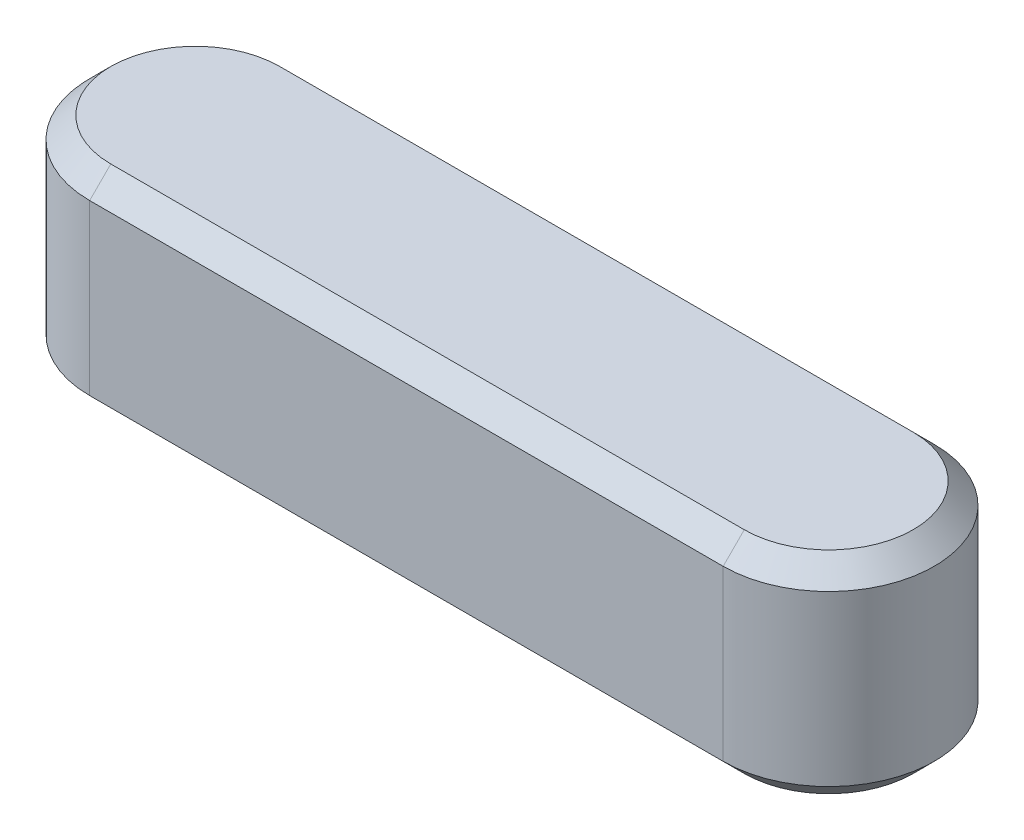
ISO-10303-21;
HEADER;
FILE_DESCRIPTION(('STEP AP214'),'2;1');
FILE_NAME('part.step','',(''),(''),'','','');
FILE_SCHEMA(('AUTOMOTIVE_DESIGN { 1 0 10303 214 1 1 1 1 }'));
ENDSEC;
DATA;
#1=APPLICATION_CONTEXT('core data for automotive mechanical design processes');
#2=APPLICATION_PROTOCOL_DEFINITION('international standard','automotive_design',2000,#1);
#3=PRODUCT_CONTEXT('',#1,'mechanical');
#4=PRODUCT('Part','Part','',(#3));
#5=PRODUCT_RELATED_PRODUCT_CATEGORY('part','',(#4));
#6=PRODUCT_DEFINITION_FORMATION('','',#4);
#7=PRODUCT_DEFINITION_CONTEXT('part definition',#1,'design');
#8=PRODUCT_DEFINITION('design','',#6,#7);
#9=PRODUCT_DEFINITION_SHAPE('','',#8);
#10=(LENGTH_UNIT() NAMED_UNIT(*) SI_UNIT(.MILLI.,.METRE.));
#11=(NAMED_UNIT(*) PLANE_ANGLE_UNIT() SI_UNIT($,.RADIAN.));
#12=(NAMED_UNIT(*) SI_UNIT($,.STERADIAN.) SOLID_ANGLE_UNIT());
#13=UNCERTAINTY_MEASURE_WITH_UNIT(LENGTH_MEASURE(1.E-05),#10,'distance_accuracy_value','');
#14=(GEOMETRIC_REPRESENTATION_CONTEXT(3) GLOBAL_UNCERTAINTY_ASSIGNED_CONTEXT((#13)) GLOBAL_UNIT_ASSIGNED_CONTEXT((#10,
#11,#12)) REPRESENTATION_CONTEXT('',''));
#15=CARTESIAN_POINT('',(0.,0.,0.));
#16=DIRECTION('',(0.,0.,1.));
#17=DIRECTION('',(1.,0.,0.));
#18=AXIS2_PLACEMENT_3D('',#15,#16,#17);
#19=CARTESIAN_POINT('',(0.,2.,0.));
#20=DIRECTION('',(0.,-1.,0.));
#21=DIRECTION('',(0.,0.,-1.));
#22=AXIS2_PLACEMENT_3D('',#19,#20,#21);
#23=CYLINDRICAL_SURFACE('',#22,1.);
#24=DIRECTION('',(0.,-1.,0.));
#25=VECTOR('',#24,1.);
#26=CARTESIAN_POINT('',(0.,2.,-1.));
#27=LINE('',#26,#25);
#28=CARTESIAN_POINT('',(0.,1.8,-1.));
#29=VERTEX_POINT('',#28);
#30=CARTESIAN_POINT('',(0.,0.2,-1.));
#31=VERTEX_POINT('',#30);
#32=EDGE_CURVE('E147',#29,#31,#27,.T.);
#33=ORIENTED_EDGE('',*,*,#32,.T.);
#34=CARTESIAN_POINT('',(0.,0.2,0.));
#35=DIRECTION('',(0.,1.,0.));
#36=DIRECTION('',(0.,0.,1.));
#37=AXIS2_PLACEMENT_3D('',#34,#35,#36);
#38=CIRCLE('',#37,1.);
#39=CARTESIAN_POINT('',(0.,0.2,1.));
#40=VERTEX_POINT('',#39);
#41=EDGE_CURVE('E156',#31,#40,#38,.T.);
#42=ORIENTED_EDGE('',*,*,#41,.T.);
#43=DIRECTION('',(0.,-1.,0.));
#44=VECTOR('',#43,1.);
#45=CARTESIAN_POINT('',(0.,2.,1.));
#46=LINE('',#45,#44);
#47=CARTESIAN_POINT('',(0.,1.8,1.));
#48=VERTEX_POINT('',#47);
#49=EDGE_CURVE('E125',#48,#40,#46,.T.);
#50=ORIENTED_EDGE('',*,*,#49,.F.);
#51=CARTESIAN_POINT('',(0.,1.8,0.));
#52=DIRECTION('',(0.,1.,0.));
#53=DIRECTION('',(0.,0.,1.));
#54=AXIS2_PLACEMENT_3D('',#51,#52,#53);
#55=CIRCLE('',#54,1.);
#56=EDGE_CURVE('E158',#48,#29,#55,.F.);
#57=ORIENTED_EDGE('',*,*,#56,.T.);
#58=EDGE_LOOP('',(#33,#42,#50,#57));
#59=FACE_BOUND('',#58,.T.);
#60=ADVANCED_FACE('F38',(#59),#23,.T.);
#61=CARTESIAN_POINT('',(0.,2.,1.));
#62=DIRECTION('',(0.,0.,-1.));
#63=DIRECTION('',(-1.,0.,0.));
#64=AXIS2_PLACEMENT_3D('',#61,#62,#63);
#65=PLANE('',#64);
#66=ORIENTED_EDGE('',*,*,#49,.T.);
#67=DIRECTION('',(1.,0.,0.));
#68=VECTOR('',#67,1.);
#69=CARTESIAN_POINT('',(0.,0.2,1.));
#70=LINE('',#69,#68);
#71=CARTESIAN_POINT('',(6.,0.2,1.));
#72=VERTEX_POINT('',#71);
#73=EDGE_CURVE('E124',#40,#72,#70,.T.);
#74=ORIENTED_EDGE('',*,*,#73,.T.);
#75=DIRECTION('',(0.,-1.,0.));
#76=VECTOR('',#75,1.);
#77=CARTESIAN_POINT('',(6.,2.,1.));
#78=LINE('',#77,#76);
#79=CARTESIAN_POINT('',(6.,1.8,1.));
#80=VERTEX_POINT('',#79);
#81=EDGE_CURVE('E107',#80,#72,#78,.T.);
#82=ORIENTED_EDGE('',*,*,#81,.F.);
#83=DIRECTION('',(-1.,0.,0.));
#84=VECTOR('',#83,1.);
#85=CARTESIAN_POINT('',(0.,1.8,1.));
#86=LINE('',#85,#84);
#87=EDGE_CURVE('E121',#80,#48,#86,.T.);
#88=ORIENTED_EDGE('',*,*,#87,.T.);
#89=EDGE_LOOP('',(#66,#74,#82,#88));
#90=FACE_BOUND('',#89,.T.);
#91=ADVANCED_FACE('F120',(#90),#65,.F.);
#92=CARTESIAN_POINT('',(6.,2.,0.));
#93=DIRECTION('',(0.,-1.,0.));
#94=DIRECTION('',(0.,0.,-1.));
#95=AXIS2_PLACEMENT_3D('',#92,#93,#94);
#96=CYLINDRICAL_SURFACE('',#95,1.);
#97=ORIENTED_EDGE('',*,*,#81,.T.);
#98=CARTESIAN_POINT('',(6.,0.2,0.));
#99=DIRECTION('',(0.,1.,0.));
#100=DIRECTION('',(0.,0.,1.));
#101=AXIS2_PLACEMENT_3D('',#98,#99,#100);
#102=CIRCLE('',#101,1.);
#103=CARTESIAN_POINT('',(6.,0.2,-1.));
#104=VERTEX_POINT('',#103);
#105=EDGE_CURVE('E113',#72,#104,#102,.T.);
#106=ORIENTED_EDGE('',*,*,#105,.T.);
#107=DIRECTION('',(0.,-1.,0.));
#108=VECTOR('',#107,1.);
#109=CARTESIAN_POINT('',(6.,2.,-1.));
#110=LINE('',#109,#108);
#111=CARTESIAN_POINT('',(6.,1.8,-1.));
#112=VERTEX_POINT('',#111);
#113=EDGE_CURVE('E109',#112,#104,#110,.T.);
#114=ORIENTED_EDGE('',*,*,#113,.F.);
#115=CARTESIAN_POINT('',(6.,1.8,0.));
#116=DIRECTION('',(0.,1.,0.));
#117=DIRECTION('',(0.,0.,1.));
#118=AXIS2_PLACEMENT_3D('',#115,#116,#117);
#119=CIRCLE('',#118,1.);
#120=EDGE_CURVE('E104',#112,#80,#119,.F.);
#121=ORIENTED_EDGE('',*,*,#120,.T.);
#122=EDGE_LOOP('',(#97,#106,#114,#121));
#123=FACE_BOUND('',#122,.T.);
#124=ADVANCED_FACE('F106',(#123),#96,.T.);
#125=CARTESIAN_POINT('',(0.,2.,-1.));
#126=DIRECTION('',(0.,0.,1.));
#127=DIRECTION('',(1.,0.,0.));
#128=AXIS2_PLACEMENT_3D('',#125,#126,#127);
#129=PLANE('',#128);
#130=ORIENTED_EDGE('',*,*,#113,.T.);
#131=DIRECTION('',(-1.,0.,0.));
#132=VECTOR('',#131,1.);
#133=CARTESIAN_POINT('',(0.,0.2,-1.));
#134=LINE('',#133,#132);
#135=EDGE_CURVE('E160',#104,#31,#134,.T.);
#136=ORIENTED_EDGE('',*,*,#135,.T.);
#137=ORIENTED_EDGE('',*,*,#32,.F.);
#138=DIRECTION('',(1.,0.,0.));
#139=VECTOR('',#138,1.);
#140=CARTESIAN_POINT('',(6.,1.8,-1.));
#141=LINE('',#140,#139);
#142=EDGE_CURVE('E162',#29,#112,#141,.T.);
#143=ORIENTED_EDGE('',*,*,#142,.T.);
#144=EDGE_LOOP('',(#130,#136,#137,#143));
#145=FACE_BOUND('',#144,.T.);
#146=ADVANCED_FACE('F200',(#145),#129,.F.);
#147=CARTESIAN_POINT('',(0.,2.,0.));
#148=DIRECTION('',(0.,1.,0.));
#149=DIRECTION('',(0.,0.,1.));
#150=AXIS2_PLACEMENT_3D('',#147,#148,#149);
#151=PLANE('',#150);
#152=CARTESIAN_POINT('',(6.,2.,0.));
#153=DIRECTION('',(0.,1.,0.));
#154=DIRECTION('',(0.,0.,1.));
#155=AXIS2_PLACEMENT_3D('',#152,#153,#154);
#156=CIRCLE('',#155,0.799999999999999);
#157=CARTESIAN_POINT('',(6.,2.,0.799999999999999));
#158=VERTEX_POINT('',#157);
#159=CARTESIAN_POINT('',(6.,2.,-0.799999999999999));
#160=VERTEX_POINT('',#159);
#161=EDGE_CURVE('E47',#158,#160,#156,.T.);
#162=ORIENTED_EDGE('',*,*,#161,.T.);
#163=DIRECTION('',(-1.,0.,0.));
#164=VECTOR('',#163,1.);
#165=CARTESIAN_POINT('',(0.,2.,-0.799999999999999));
#166=LINE('',#165,#164);
#167=CARTESIAN_POINT('',(0.,2.,-0.799999999999999));
#168=VERTEX_POINT('',#167);
#169=EDGE_CURVE('E11',#160,#168,#166,.T.);
#170=ORIENTED_EDGE('',*,*,#169,.T.);
#171=CARTESIAN_POINT('',(0.,2.,0.));
#172=DIRECTION('',(0.,1.,0.));
#173=DIRECTION('',(0.,0.,1.));
#174=AXIS2_PLACEMENT_3D('',#171,#172,#173);
#175=CIRCLE('',#174,0.799999999999999);
#176=CARTESIAN_POINT('',(0.,2.,0.799999999999999));
#177=VERTEX_POINT('',#176);
#178=EDGE_CURVE('E154',#168,#177,#175,.T.);
#179=ORIENTED_EDGE('',*,*,#178,.T.);
#180=DIRECTION('',(1.,0.,0.));
#181=VECTOR('',#180,1.);
#182=CARTESIAN_POINT('',(6.,2.,0.799999999999999));
#183=LINE('',#182,#181);
#184=EDGE_CURVE('E58',#177,#158,#183,.T.);
#185=ORIENTED_EDGE('',*,*,#184,.T.);
#186=EDGE_LOOP('',(#162,#170,#179,#185));
#187=FACE_BOUND('',#186,.T.);
#188=ADVANCED_FACE('F206',(#187),#151,.T.);
#189=CARTESIAN_POINT('',(0.,0.,0.));
#190=DIRECTION('',(0.,1.,0.));
#191=DIRECTION('',(0.,0.,1.));
#192=AXIS2_PLACEMENT_3D('',#189,#190,#191);
#193=PLANE('',#192);
#194=CARTESIAN_POINT('',(6.,0.,0.));
#195=DIRECTION('',(0.,1.,0.));
#196=DIRECTION('',(0.,0.,1.));
#197=AXIS2_PLACEMENT_3D('',#194,#195,#196);
#198=CIRCLE('',#197,0.799999999999999);
#199=CARTESIAN_POINT('',(6.,0.,-0.799999999999999));
#200=VERTEX_POINT('',#199);
#201=CARTESIAN_POINT('',(6.,0.,0.799999999999999));
#202=VERTEX_POINT('',#201);
#203=EDGE_CURVE('E167',#200,#202,#198,.F.);
#204=ORIENTED_EDGE('',*,*,#203,.T.);
#205=DIRECTION('',(-1.,0.,0.));
#206=VECTOR('',#205,1.);
#207=CARTESIAN_POINT('',(0.,0.,0.799999999999999));
#208=LINE('',#207,#206);
#209=CARTESIAN_POINT('',(0.,0.,0.799999999999999));
#210=VERTEX_POINT('',#209);
#211=EDGE_CURVE('E114',#202,#210,#208,.T.);
#212=ORIENTED_EDGE('',*,*,#211,.T.);
#213=CARTESIAN_POINT('',(0.,0.,0.));
#214=DIRECTION('',(0.,1.,0.));
#215=DIRECTION('',(0.,0.,1.));
#216=AXIS2_PLACEMENT_3D('',#213,#214,#215);
#217=CIRCLE('',#216,0.799999999999999);
#218=CARTESIAN_POINT('',(0.,0.,-0.799999999999999));
#219=VERTEX_POINT('',#218);
#220=EDGE_CURVE('E171',#210,#219,#217,.F.);
#221=ORIENTED_EDGE('',*,*,#220,.T.);
#222=DIRECTION('',(1.,0.,0.));
#223=VECTOR('',#222,1.);
#224=CARTESIAN_POINT('',(0.,0.,-0.799999999999999));
#225=LINE('',#224,#223);
#226=EDGE_CURVE('E169',#219,#200,#225,.T.);
#227=ORIENTED_EDGE('',*,*,#226,.T.);
#228=EDGE_LOOP('',(#204,#212,#221,#227));
#229=FACE_BOUND('',#228,.T.);
#230=ADVANCED_FACE('F208',(#229),#193,.F.);
#231=CARTESIAN_POINT('',(0.,0.2,-1.));
#232=DIRECTION('',(0.,0.707106781186551,0.707106781186544));
#233=DIRECTION('',(-1.,0.,0.));
#234=AXIS2_PLACEMENT_3D('',#231,#232,#233);
#235=PLANE('',#234);
#236=DIRECTION('',(0.,0.707106781186544,-0.707106781186551));
#237=VECTOR('',#236,1.);
#238=CARTESIAN_POINT('',(6.,0.,-0.799999999999999));
#239=LINE('',#238,#237);
#240=EDGE_CURVE('E148',#200,#104,#239,.T.);
#241=ORIENTED_EDGE('',*,*,#240,.F.);
#242=ORIENTED_EDGE('',*,*,#226,.F.);
#243=DIRECTION('',(0.,-0.707106781186544,0.707106781186551));
#244=VECTOR('',#243,1.);
#245=CARTESIAN_POINT('',(0.,0.2,-1.));
#246=LINE('',#245,#244);
#247=EDGE_CURVE('E144',#31,#219,#246,.T.);
#248=ORIENTED_EDGE('',*,*,#247,.F.);
#249=ORIENTED_EDGE('',*,*,#135,.F.);
#250=EDGE_LOOP('',(#241,#242,#248,#249));
#251=FACE_BOUND('',#250,.T.);
#252=ADVANCED_FACE('F187',(#251),#235,.F.);
#253=CARTESIAN_POINT('',(0.,0.2,0.));
#254=DIRECTION('',(0.,1.,0.));
#255=DIRECTION('',(0.,0.,1.));
#256=AXIS2_PLACEMENT_3D('',#253,#254,#255);
#257=CONICAL_SURFACE('',#256,1.,0.785398163397453);
#258=ORIENTED_EDGE('',*,*,#247,.T.);
#259=ORIENTED_EDGE('',*,*,#220,.F.);
#260=DIRECTION('',(0.,-0.707106781186544,-0.707106781186551));
#261=VECTOR('',#260,1.);
#262=CARTESIAN_POINT('',(0.,0.2,1.));
#263=LINE('',#262,#261);
#264=EDGE_CURVE('E135',#40,#210,#263,.T.);
#265=ORIENTED_EDGE('',*,*,#264,.F.);
#266=ORIENTED_EDGE('',*,*,#41,.F.);
#267=EDGE_LOOP('',(#258,#259,#265,#266));
#268=FACE_BOUND('',#267,.T.);
#269=ADVANCED_FACE('F191',(#268),#257,.T.);
#270=CARTESIAN_POINT('',(6.,0.2,0.));
#271=DIRECTION('',(0.,1.,0.));
#272=DIRECTION('',(0.,0.,1.));
#273=AXIS2_PLACEMENT_3D('',#270,#271,#272);
#274=CONICAL_SURFACE('',#273,1.,0.785398163397453);
#275=ORIENTED_EDGE('',*,*,#240,.T.);
#276=ORIENTED_EDGE('',*,*,#105,.F.);
#277=DIRECTION('',(0.,0.707106781186544,0.707106781186551));
#278=VECTOR('',#277,1.);
#279=CARTESIAN_POINT('',(6.,0.,0.799999999999999));
#280=LINE('',#279,#278);
#281=EDGE_CURVE('E134',#202,#72,#280,.T.);
#282=ORIENTED_EDGE('',*,*,#281,.F.);
#283=ORIENTED_EDGE('',*,*,#203,.F.);
#284=EDGE_LOOP('',(#275,#276,#282,#283));
#285=FACE_BOUND('',#284,.T.);
#286=ADVANCED_FACE('F199',(#285),#274,.T.);
#287=CARTESIAN_POINT('',(0.,0.2,1.));
#288=DIRECTION('',(0.,0.707106781186551,-0.707106781186544));
#289=DIRECTION('',(1.,0.,0.));
#290=AXIS2_PLACEMENT_3D('',#287,#288,#289);
#291=PLANE('',#290);
#292=ORIENTED_EDGE('',*,*,#264,.T.);
#293=ORIENTED_EDGE('',*,*,#211,.F.);
#294=ORIENTED_EDGE('',*,*,#281,.T.);
#295=ORIENTED_EDGE('',*,*,#73,.F.);
#296=EDGE_LOOP('',(#292,#293,#294,#295));
#297=FACE_BOUND('',#296,.T.);
#298=ADVANCED_FACE('F194',(#297),#291,.F.);
#299=CARTESIAN_POINT('',(0.,2.,0.799999999999999));
#300=DIRECTION('',(0.,0.707106781186548,0.707106781186547));
#301=DIRECTION('',(-1.,0.,0.));
#302=AXIS2_PLACEMENT_3D('',#299,#300,#301);
#303=PLANE('',#302);
#304=DIRECTION('',(0.,0.707106781186547,-0.707106781186548));
#305=VECTOR('',#304,1.);
#306=CARTESIAN_POINT('',(0.,1.8,1.));
#307=LINE('',#306,#305);
#308=EDGE_CURVE('E130',#48,#177,#307,.T.);
#309=ORIENTED_EDGE('',*,*,#308,.F.);
#310=ORIENTED_EDGE('',*,*,#87,.F.);
#311=DIRECTION('',(0.,-0.707106781186547,0.707106781186548));
#312=VECTOR('',#311,1.);
#313=CARTESIAN_POINT('',(6.,2.,0.799999999999999));
#314=LINE('',#313,#312);
#315=EDGE_CURVE('E42',#158,#80,#314,.T.);
#316=ORIENTED_EDGE('',*,*,#315,.F.);
#317=ORIENTED_EDGE('',*,*,#184,.F.);
#318=EDGE_LOOP('',(#309,#310,#316,#317));
#319=FACE_BOUND('',#318,.T.);
#320=ADVANCED_FACE('F40',(#319),#303,.T.);
#321=CARTESIAN_POINT('',(6.,2.,0.));
#322=DIRECTION('',(0.,-1.,0.));
#323=DIRECTION('',(0.,0.,-1.));
#324=AXIS2_PLACEMENT_3D('',#321,#322,#323);
#325=CONICAL_SURFACE('',#324,0.799999999999999,0.785398163397449);
#326=ORIENTED_EDGE('',*,*,#315,.T.);
#327=ORIENTED_EDGE('',*,*,#120,.F.);
#328=DIRECTION('',(0.,-0.707106781186547,-0.707106781186548));
#329=VECTOR('',#328,1.);
#330=CARTESIAN_POINT('',(6.,2.,-0.799999999999999));
#331=LINE('',#330,#329);
#332=EDGE_CURVE('E137',#160,#112,#331,.T.);
#333=ORIENTED_EDGE('',*,*,#332,.F.);
#334=ORIENTED_EDGE('',*,*,#161,.F.);
#335=EDGE_LOOP('',(#326,#327,#333,#334));
#336=FACE_BOUND('',#335,.T.);
#337=ADVANCED_FACE('F133',(#336),#325,.T.);
#338=CARTESIAN_POINT('',(0.,2.,0.));
#339=DIRECTION('',(0.,-1.,0.));
#340=DIRECTION('',(0.,0.,-1.));
#341=AXIS2_PLACEMENT_3D('',#338,#339,#340);
#342=CONICAL_SURFACE('',#341,0.799999999999999,0.785398163397449);
#343=ORIENTED_EDGE('',*,*,#308,.T.);
#344=ORIENTED_EDGE('',*,*,#178,.F.);
#345=DIRECTION('',(0.,0.707106781186547,0.707106781186548));
#346=VECTOR('',#345,1.);
#347=CARTESIAN_POINT('',(0.,1.8,-1.));
#348=LINE('',#347,#346);
#349=EDGE_CURVE('E140',#29,#168,#348,.T.);
#350=ORIENTED_EDGE('',*,*,#349,.F.);
#351=ORIENTED_EDGE('',*,*,#56,.F.);
#352=EDGE_LOOP('',(#343,#344,#350,#351));
#353=FACE_BOUND('',#352,.T.);
#354=ADVANCED_FACE('F205',(#353),#342,.T.);
#355=CARTESIAN_POINT('',(0.,2.,-0.799999999999999));
#356=DIRECTION('',(0.,0.707106781186548,-0.707106781186547));
#357=DIRECTION('',(1.,0.,0.));
#358=AXIS2_PLACEMENT_3D('',#355,#356,#357);
#359=PLANE('',#358);
#360=ORIENTED_EDGE('',*,*,#332,.T.);
#361=ORIENTED_EDGE('',*,*,#142,.F.);
#362=ORIENTED_EDGE('',*,*,#349,.T.);
#363=ORIENTED_EDGE('',*,*,#169,.F.);
#364=EDGE_LOOP('',(#360,#361,#362,#363));
#365=FACE_BOUND('',#364,.T.);
#366=ADVANCED_FACE('F203',(#365),#359,.T.);
#367=CLOSED_SHELL('',(#60,#91,#124,#146,#188,#230,#252,#269,#286,#298,#320,#337,#354,#366));
#368=MANIFOLD_SOLID_BREP('B2',#367);
#369=ADVANCED_BREP_SHAPE_REPRESENTATION('',(#18,#368),#14);
#370=SHAPE_DEFINITION_REPRESENTATION(#9,#369);
ENDSEC;
END-ISO-10303-21;
